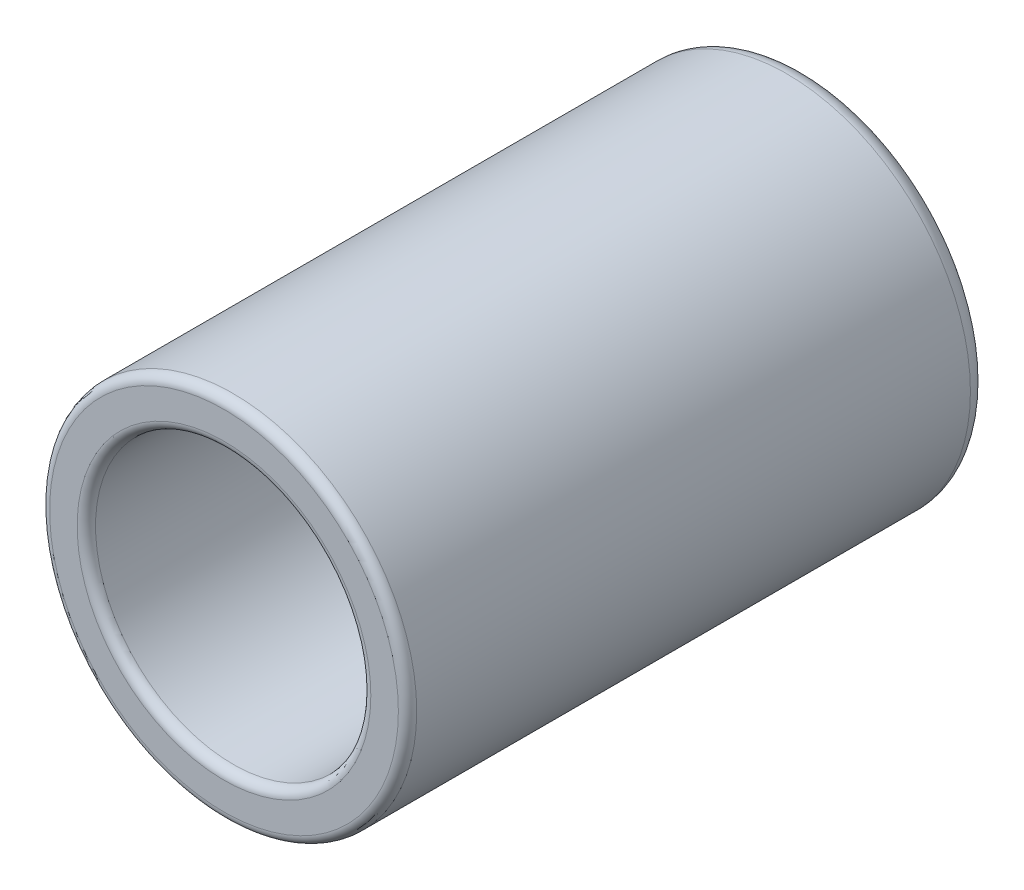
ISO-10303-21;
HEADER;
FILE_DESCRIPTION(('STEP AP214'),'2;1');
FILE_NAME('part.step','',(''),(''),'','','');
FILE_SCHEMA(('AUTOMOTIVE_DESIGN { 1 0 10303 214 1 1 1 1 }'));
ENDSEC;
DATA;
#1=APPLICATION_CONTEXT('core data for automotive mechanical design processes');
#2=APPLICATION_PROTOCOL_DEFINITION('international standard','automotive_design',2000,#1);
#3=PRODUCT_CONTEXT('',#1,'mechanical');
#4=PRODUCT('Part','Part','',(#3));
#5=PRODUCT_RELATED_PRODUCT_CATEGORY('part','',(#4));
#6=PRODUCT_DEFINITION_FORMATION('','',#4);
#7=PRODUCT_DEFINITION_CONTEXT('part definition',#1,'design');
#8=PRODUCT_DEFINITION('design','',#6,#7);
#9=PRODUCT_DEFINITION_SHAPE('','',#8);
#10=(LENGTH_UNIT() NAMED_UNIT(*) SI_UNIT(.MILLI.,.METRE.));
#11=(NAMED_UNIT(*) PLANE_ANGLE_UNIT() SI_UNIT($,.RADIAN.));
#12=(NAMED_UNIT(*) SI_UNIT($,.STERADIAN.) SOLID_ANGLE_UNIT());
#13=UNCERTAINTY_MEASURE_WITH_UNIT(LENGTH_MEASURE(1.E-05),#10,'distance_accuracy_value','');
#14=(GEOMETRIC_REPRESENTATION_CONTEXT(3) GLOBAL_UNCERTAINTY_ASSIGNED_CONTEXT((#13)) GLOBAL_UNIT_ASSIGNED_CONTEXT((#10,
#11,#12)) REPRESENTATION_CONTEXT('',''));
#15=CARTESIAN_POINT('',(0.,0.,0.));
#16=DIRECTION('',(0.,0.,1.));
#17=DIRECTION('',(1.,0.,0.));
#18=AXIS2_PLACEMENT_3D('',#15,#16,#17);
#19=CARTESIAN_POINT('',(0.,0.,9.5));
#20=DIRECTION('',(0.,0.,-1.));
#21=DIRECTION('',(-1.,0.,0.));
#22=AXIS2_PLACEMENT_3D('',#19,#20,#21);
#23=CYLINDRICAL_SURFACE('',#22,3.);
#24=CARTESIAN_POINT('',(0.,0.,0.3));
#25=DIRECTION('',(0.,0.,1.));
#26=DIRECTION('',(1.,0.,0.));
#27=AXIS2_PLACEMENT_3D('',#24,#25,#26);
#28=CIRCLE('',#27,3.);
#29=CARTESIAN_POINT('',(3.,0.,0.3));
#30=VERTEX_POINT('',#29);
#31=EDGE_CURVE('E45',#30,#30,#28,.T.);
#32=ORIENTED_EDGE('',*,*,#31,.T.);
#33=EDGE_LOOP('',(#32));
#34=FACE_BOUND('',#33,.T.);
#35=CARTESIAN_POINT('',(0.,0.,9.35));
#36=DIRECTION('',(0.,0.,1.));
#37=DIRECTION('',(1.,0.,0.));
#38=AXIS2_PLACEMENT_3D('',#35,#36,#37);
#39=CIRCLE('',#38,3.);
#40=CARTESIAN_POINT('',(3.,0.,9.35));
#41=VERTEX_POINT('',#40);
#42=EDGE_CURVE('E50',#41,#41,#39,.F.);
#43=ORIENTED_EDGE('',*,*,#42,.T.);
#44=EDGE_LOOP('',(#43));
#45=FACE_BOUND('',#44,.T.);
#46=ADVANCED_FACE('F37',(#34,#45),#23,.T.);
#47=CARTESIAN_POINT('',(0.,0.,9.5));
#48=DIRECTION('',(0.,0.,1.));
#49=DIRECTION('',(1.,0.,0.));
#50=AXIS2_PLACEMENT_3D('',#47,#48,#49);
#51=PLANE('',#50);
#52=CARTESIAN_POINT('',(0.,0.,9.5));
#53=DIRECTION('',(0.,0.,1.));
#54=DIRECTION('',(1.,0.,0.));
#55=AXIS2_PLACEMENT_3D('',#52,#53,#54);
#56=CIRCLE('',#55,2.4);
#57=CARTESIAN_POINT('',(2.4,0.,9.5));
#58=VERTEX_POINT('',#57);
#59=EDGE_CURVE('E55',#58,#58,#56,.F.);
#60=ORIENTED_EDGE('',*,*,#59,.T.);
#61=EDGE_LOOP('',(#60));
#62=FACE_BOUND('',#61,.T.);
#63=CARTESIAN_POINT('',(0.,0.,9.5));
#64=DIRECTION('',(0.,0.,1.));
#65=DIRECTION('',(1.,0.,0.));
#66=AXIS2_PLACEMENT_3D('',#63,#64,#65);
#67=CIRCLE('',#66,2.85);
#68=CARTESIAN_POINT('',(2.85,0.,9.5));
#69=VERTEX_POINT('',#68);
#70=EDGE_CURVE('E61',#69,#69,#67,.T.);
#71=ORIENTED_EDGE('',*,*,#70,.T.);
#72=EDGE_LOOP('',(#71));
#73=FACE_BOUND('',#72,.T.);
#74=ADVANCED_FACE('F98',(#62,#73),#51,.T.);
#75=CARTESIAN_POINT('',(0.,0.,0.));
#76=DIRECTION('',(0.,0.,1.));
#77=DIRECTION('',(1.,0.,0.));
#78=AXIS2_PLACEMENT_3D('',#75,#76,#77);
#79=PLANE('',#78);
#80=CARTESIAN_POINT('',(0.,0.,0.));
#81=DIRECTION('',(0.,0.,1.));
#82=DIRECTION('',(1.,0.,0.));
#83=AXIS2_PLACEMENT_3D('',#80,#81,#82);
#84=CIRCLE('',#83,2.7);
#85=CARTESIAN_POINT('',(2.7,0.,0.));
#86=VERTEX_POINT('',#85);
#87=EDGE_CURVE('E10',#86,#86,#84,.F.);
#88=ORIENTED_EDGE('',*,*,#87,.T.);
#89=EDGE_LOOP('',(#88));
#90=FACE_BOUND('',#89,.T.);
#91=CARTESIAN_POINT('',(0.,0.,0.));
#92=DIRECTION('',(0.,0.,1.));
#93=DIRECTION('',(1.,0.,0.));
#94=AXIS2_PLACEMENT_3D('',#91,#92,#93);
#95=CIRCLE('',#94,1.25);
#96=CARTESIAN_POINT('',(1.25,0.,0.));
#97=VERTEX_POINT('',#96);
#98=EDGE_CURVE('E73',#97,#97,#95,.F.);
#99=ORIENTED_EDGE('',*,*,#98,.F.);
#100=EDGE_LOOP('',(#99));
#101=FACE_BOUND('',#100,.T.);
#102=ADVANCED_FACE('F92',(#90,#101),#79,.F.);
#103=CARTESIAN_POINT('',(0.,0.,6.));
#104=DIRECTION('',(0.,0.,1.));
#105=DIRECTION('',(1.,0.,0.));
#106=AXIS2_PLACEMENT_3D('',#103,#104,#105);
#107=CYLINDRICAL_SURFACE('',#106,2.25);
#108=CARTESIAN_POINT('',(0.,0.,9.35));
#109=DIRECTION('',(0.,0.,1.));
#110=DIRECTION('',(1.,0.,0.));
#111=AXIS2_PLACEMENT_3D('',#108,#109,#110);
#112=CIRCLE('',#111,2.25);
#113=CARTESIAN_POINT('',(2.25,0.,9.35));
#114=VERTEX_POINT('',#113);
#115=EDGE_CURVE('E65',#114,#114,#112,.T.);
#116=ORIENTED_EDGE('',*,*,#115,.T.);
#117=EDGE_LOOP('',(#116));
#118=FACE_BOUND('',#117,.T.);
#119=CARTESIAN_POINT('',(0.,0.,6.));
#120=DIRECTION('',(0.,0.,1.));
#121=DIRECTION('',(1.,0.,0.));
#122=AXIS2_PLACEMENT_3D('',#119,#120,#121);
#123=CIRCLE('',#122,2.25);
#124=CARTESIAN_POINT('',(2.25,0.,6.));
#125=VERTEX_POINT('',#124);
#126=EDGE_CURVE('E69',#125,#125,#123,.T.);
#127=ORIENTED_EDGE('',*,*,#126,.F.);
#128=EDGE_LOOP('',(#127));
#129=FACE_BOUND('',#128,.T.);
#130=ADVANCED_FACE('F87',(#118,#129),#107,.F.);
#131=CARTESIAN_POINT('',(0.,0.,6.));
#132=DIRECTION('',(0.,0.,1.));
#133=DIRECTION('',(1.,0.,0.));
#134=AXIS2_PLACEMENT_3D('',#131,#132,#133);
#135=PLANE('',#134);
#136=CARTESIAN_POINT('',(0.,0.,6.));
#137=DIRECTION('',(0.,0.,1.));
#138=DIRECTION('',(1.,0.,0.));
#139=AXIS2_PLACEMENT_3D('',#136,#137,#138);
#140=CIRCLE('',#139,1.25);
#141=CARTESIAN_POINT('',(1.25,0.,6.));
#142=VERTEX_POINT('',#141);
#143=EDGE_CURVE('E77',#142,#142,#140,.T.);
#144=ORIENTED_EDGE('',*,*,#143,.F.);
#145=EDGE_LOOP('',(#144));
#146=FACE_BOUND('',#145,.T.);
#147=ORIENTED_EDGE('',*,*,#126,.T.);
#148=EDGE_LOOP('',(#147));
#149=FACE_BOUND('',#148,.T.);
#150=ADVANCED_FACE('F84',(#146,#149),#135,.T.);
#151=CARTESIAN_POINT('',(0.,0.,-3.53553390593274));
#152=DIRECTION('',(0.,0.,1.));
#153=DIRECTION('',(1.,0.,0.));
#154=AXIS2_PLACEMENT_3D('',#151,#152,#153);
#155=CYLINDRICAL_SURFACE('',#154,1.25);
#156=ORIENTED_EDGE('',*,*,#98,.T.);
#157=EDGE_LOOP('',(#156));
#158=FACE_BOUND('',#157,.T.);
#159=ORIENTED_EDGE('',*,*,#143,.T.);
#160=EDGE_LOOP('',(#159));
#161=FACE_BOUND('',#160,.T.);
#162=ADVANCED_FACE('F82',(#158,#161),#155,.F.);
#163=CARTESIAN_POINT('',(0.,0.,9.35));
#164=DIRECTION('',(0.,0.,1.));
#165=DIRECTION('',(1.,0.,0.));
#166=AXIS2_PLACEMENT_3D('',#163,#164,#165);
#167=TOROIDAL_SURFACE('',#166,2.4,0.15);
#168=ORIENTED_EDGE('',*,*,#59,.F.);
#169=EDGE_LOOP('',(#168));
#170=FACE_BOUND('',#169,.T.);
#171=ORIENTED_EDGE('',*,*,#115,.F.);
#172=EDGE_LOOP('',(#171));
#173=FACE_BOUND('',#172,.T.);
#174=ADVANCED_FACE('F109',(#170,#173),#167,.T.);
#175=CARTESIAN_POINT('',(0.,0.,9.35));
#176=DIRECTION('',(0.,0.,1.));
#177=DIRECTION('',(1.,0.,0.));
#178=AXIS2_PLACEMENT_3D('',#175,#176,#177);
#179=TOROIDAL_SURFACE('',#178,2.85,0.15);
#180=ORIENTED_EDGE('',*,*,#42,.F.);
#181=EDGE_LOOP('',(#180));
#182=FACE_BOUND('',#181,.T.);
#183=ORIENTED_EDGE('',*,*,#70,.F.);
#184=EDGE_LOOP('',(#183));
#185=FACE_BOUND('',#184,.T.);
#186=ADVANCED_FACE('F111',(#182,#185),#179,.T.);
#187=CARTESIAN_POINT('',(0.,0.,0.3));
#188=DIRECTION('',(0.,0.,1.));
#189=DIRECTION('',(1.,0.,0.));
#190=AXIS2_PLACEMENT_3D('',#187,#188,#189);
#191=TOROIDAL_SURFACE('',#190,2.7,0.3);
#192=ORIENTED_EDGE('',*,*,#87,.F.);
#193=EDGE_LOOP('',(#192));
#194=FACE_BOUND('',#193,.T.);
#195=ORIENTED_EDGE('',*,*,#31,.F.);
#196=EDGE_LOOP('',(#195));
#197=FACE_BOUND('',#196,.T.);
#198=ADVANCED_FACE('F39',(#194,#197),#191,.T.);
#199=CLOSED_SHELL('',(#46,#74,#102,#130,#150,#162,#174,#186,#198));
#200=MANIFOLD_SOLID_BREP('B2',#199);
#201=ADVANCED_BREP_SHAPE_REPRESENTATION('',(#18,#200),#14);
#202=SHAPE_DEFINITION_REPRESENTATION(#9,#201);
ENDSEC;
END-ISO-10303-21;
